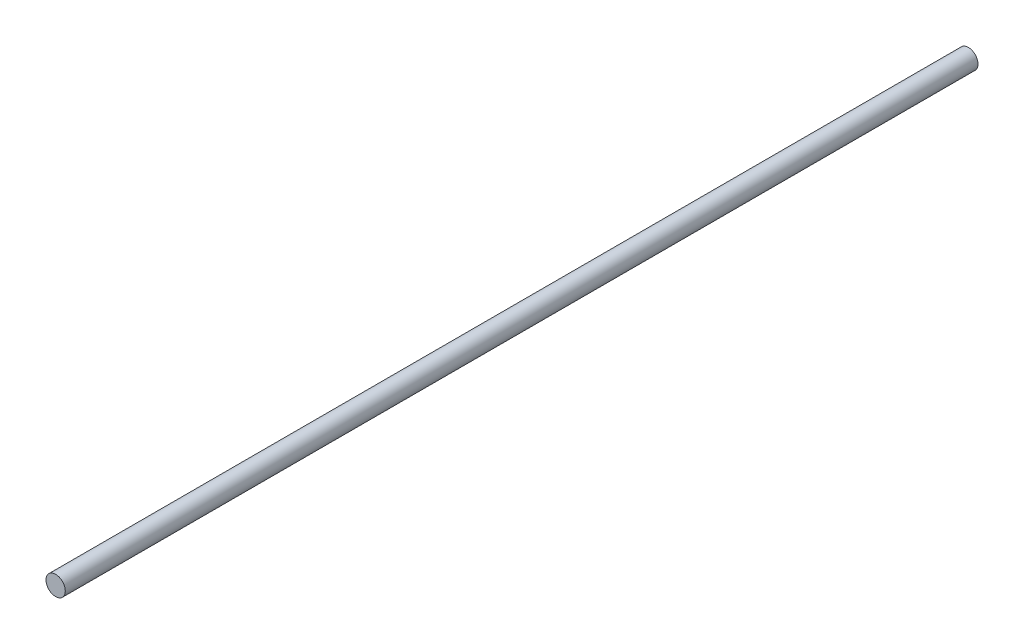
ISO-10303-21;
HEADER;
FILE_DESCRIPTION(('STEP AP214'),'2;1');
FILE_NAME('part.step','',(''),(''),'','','');
FILE_SCHEMA(('AUTOMOTIVE_DESIGN { 1 0 10303 214 1 1 1 1 }'));
ENDSEC;
DATA;
#1=APPLICATION_CONTEXT('core data for automotive mechanical design processes');
#2=APPLICATION_PROTOCOL_DEFINITION('international standard','automotive_design',2000,#1);
#3=PRODUCT_CONTEXT('',#1,'mechanical');
#4=PRODUCT('Part','Part','',(#3));
#5=PRODUCT_RELATED_PRODUCT_CATEGORY('part','',(#4));
#6=PRODUCT_DEFINITION_FORMATION('','',#4);
#7=PRODUCT_DEFINITION_CONTEXT('part definition',#1,'design');
#8=PRODUCT_DEFINITION('design','',#6,#7);
#9=PRODUCT_DEFINITION_SHAPE('','',#8);
#10=(LENGTH_UNIT() NAMED_UNIT(*) SI_UNIT(.MILLI.,.METRE.));
#11=(NAMED_UNIT(*) PLANE_ANGLE_UNIT() SI_UNIT($,.RADIAN.));
#12=(NAMED_UNIT(*) SI_UNIT($,.STERADIAN.) SOLID_ANGLE_UNIT());
#13=UNCERTAINTY_MEASURE_WITH_UNIT(LENGTH_MEASURE(1.E-05),#10,'distance_accuracy_value','');
#14=(GEOMETRIC_REPRESENTATION_CONTEXT(3) GLOBAL_UNCERTAINTY_ASSIGNED_CONTEXT((#13)) GLOBAL_UNIT_ASSIGNED_CONTEXT((#10,
#11,#12)) REPRESENTATION_CONTEXT('',''));
#15=CARTESIAN_POINT('',(0.,0.,0.));
#16=DIRECTION('',(0.,0.,1.));
#17=DIRECTION('',(1.,0.,0.));
#18=AXIS2_PLACEMENT_3D('',#15,#16,#17);
#19=CARTESIAN_POINT('',(0.,0.,0.));
#20=DIRECTION('',(0.,0.,1.));
#21=DIRECTION('',(1.,0.,0.));
#22=AXIS2_PLACEMENT_3D('',#19,#20,#21);
#23=CYLINDRICAL_SURFACE('',#22,2.75);
#24=CARTESIAN_POINT('',(0.,0.,0.));
#25=DIRECTION('',(0.,0.,1.));
#26=DIRECTION('',(1.,0.,0.));
#27=AXIS2_PLACEMENT_3D('',#24,#25,#26);
#28=CIRCLE('',#27,2.75);
#29=CARTESIAN_POINT('',(2.75,0.,0.));
#30=VERTEX_POINT('',#29);
#31=EDGE_CURVE('E10',#30,#30,#28,.T.);
#32=ORIENTED_EDGE('',*,*,#31,.T.);
#33=EDGE_LOOP('',(#32));
#34=FACE_BOUND('',#33,.T.);
#35=CARTESIAN_POINT('',(0.,0.,260.));
#36=DIRECTION('',(0.,0.,1.));
#37=DIRECTION('',(1.,0.,0.));
#38=AXIS2_PLACEMENT_3D('',#35,#36,#37);
#39=CIRCLE('',#38,2.75);
#40=CARTESIAN_POINT('',(2.75,0.,260.));
#41=VERTEX_POINT('',#40);
#42=EDGE_CURVE('E39',#41,#41,#39,.T.);
#43=ORIENTED_EDGE('',*,*,#42,.F.);
#44=EDGE_LOOP('',(#43));
#45=FACE_BOUND('',#44,.T.);
#46=ADVANCED_FACE('F33',(#34,#45),#23,.T.);
#47=CARTESIAN_POINT('',(2.75,0.,0.));
#48=DIRECTION('',(0.,0.,-1.));
#49=DIRECTION('',(-1.,0.,0.));
#50=AXIS2_PLACEMENT_3D('',#47,#48,#49);
#51=PLANE('',#50);
#52=ORIENTED_EDGE('',*,*,#31,.F.);
#53=EDGE_LOOP('',(#52));
#54=FACE_BOUND('',#53,.T.);
#55=ADVANCED_FACE('F48',(#54),#51,.T.);
#56=CARTESIAN_POINT('',(0.,0.,260.));
#57=DIRECTION('',(0.,0.,1.));
#58=DIRECTION('',(1.,0.,0.));
#59=AXIS2_PLACEMENT_3D('',#56,#57,#58);
#60=PLANE('',#59);
#61=ORIENTED_EDGE('',*,*,#42,.T.);
#62=EDGE_LOOP('',(#61));
#63=FACE_BOUND('',#62,.T.);
#64=ADVANCED_FACE('F45',(#63),#60,.T.);
#65=CLOSED_SHELL('',(#46,#55,#64));
#66=MANIFOLD_SOLID_BREP('B2',#65);
#67=ADVANCED_BREP_SHAPE_REPRESENTATION('',(#18,#66),#14);
#68=SHAPE_DEFINITION_REPRESENTATION(#9,#67);
ENDSEC;
END-ISO-10303-21;
